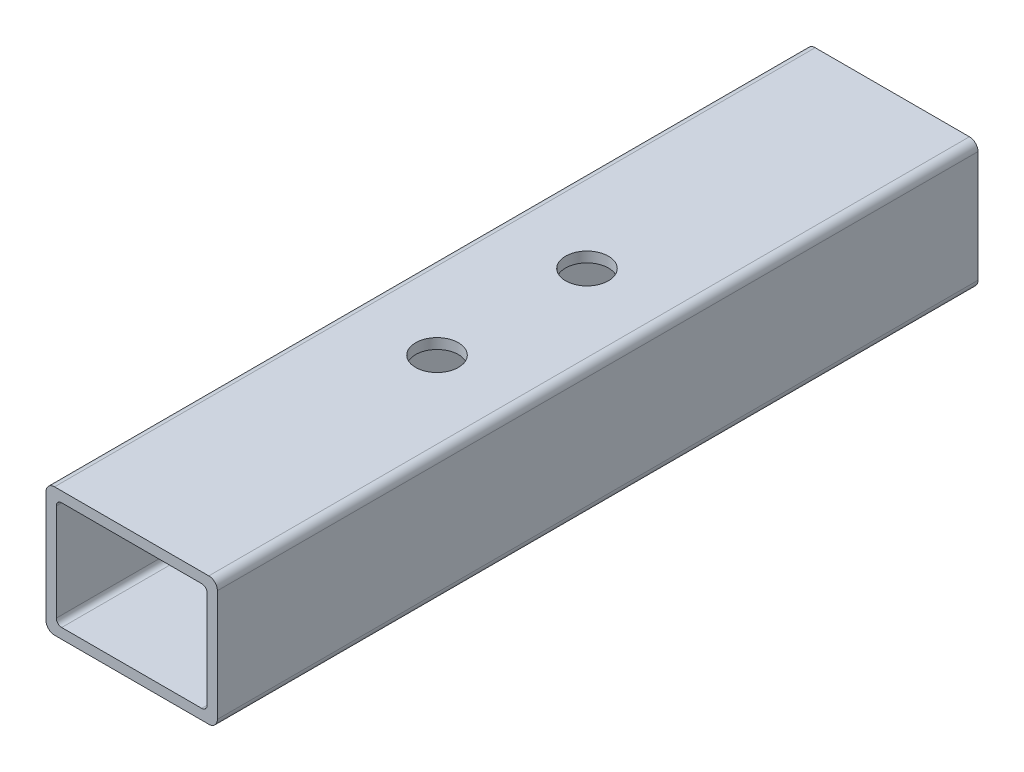
ISO-10303-21;
HEADER;
FILE_DESCRIPTION(('STEP AP214'),'2;1');
FILE_NAME('part.step','',(''),(''),'','','');
FILE_SCHEMA(('AUTOMOTIVE_DESIGN { 1 0 10303 214 1 1 1 1 }'));
ENDSEC;
DATA;
#1=APPLICATION_CONTEXT('core data for automotive mechanical design processes');
#2=APPLICATION_PROTOCOL_DEFINITION('international standard','automotive_design',2000,#1);
#3=PRODUCT_CONTEXT('',#1,'mechanical');
#4=PRODUCT('Part','Part','',(#3));
#5=PRODUCT_RELATED_PRODUCT_CATEGORY('part','',(#4));
#6=PRODUCT_DEFINITION_FORMATION('','',#4);
#7=PRODUCT_DEFINITION_CONTEXT('part definition',#1,'design');
#8=PRODUCT_DEFINITION('design','',#6,#7);
#9=PRODUCT_DEFINITION_SHAPE('','',#8);
#10=(LENGTH_UNIT() NAMED_UNIT(*) SI_UNIT(.MILLI.,.METRE.));
#11=(NAMED_UNIT(*) PLANE_ANGLE_UNIT() SI_UNIT($,.RADIAN.));
#12=(NAMED_UNIT(*) SI_UNIT($,.STERADIAN.) SOLID_ANGLE_UNIT());
#13=UNCERTAINTY_MEASURE_WITH_UNIT(LENGTH_MEASURE(1.E-05),#10,'distance_accuracy_value','');
#14=(GEOMETRIC_REPRESENTATION_CONTEXT(3) GLOBAL_UNCERTAINTY_ASSIGNED_CONTEXT((#13)) GLOBAL_UNIT_ASSIGNED_CONTEXT((#10,
#11,#12)) REPRESENTATION_CONTEXT('',''));
#15=CARTESIAN_POINT('',(0.,0.,0.));
#16=DIRECTION('',(0.,0.,1.));
#17=DIRECTION('',(1.,0.,0.));
#18=AXIS2_PLACEMENT_3D('',#15,#16,#17);
#19=CARTESIAN_POINT('',(22.86,-16.51,225.425));
#20=DIRECTION('',(0.,0.,1.));
#21=DIRECTION('',(1.,0.,0.));
#22=AXIS2_PLACEMENT_3D('',#19,#20,#21);
#23=PLANE('',#22);
#24=CARTESIAN_POINT('',(22.86,-16.51,225.425));
#25=DIRECTION('',(0.,0.,1.));
#26=DIRECTION('',(1.,0.,0.));
#27=AXIS2_PLACEMENT_3D('',#24,#25,#26);
#28=CIRCLE('',#27,2.53999999999999);
#29=CARTESIAN_POINT('',(22.86,-19.05,225.425));
#30=VERTEX_POINT('',#29);
#31=CARTESIAN_POINT('',(25.4,-16.51,225.425));
#32=VERTEX_POINT('',#31);
#33=EDGE_CURVE('E218',#30,#32,#28,.T.);
#34=ORIENTED_EDGE('',*,*,#33,.T.);
#35=DIRECTION('',(0.,1.,0.));
#36=VECTOR('',#35,1.);
#37=CARTESIAN_POINT('',(25.4,-16.51,225.425));
#38=LINE('',#37,#36);
#39=CARTESIAN_POINT('',(25.4,16.51,225.425));
#40=VERTEX_POINT('',#39);
#41=EDGE_CURVE('E221',#32,#40,#38,.T.);
#42=ORIENTED_EDGE('',*,*,#41,.T.);
#43=CARTESIAN_POINT('',(22.86,16.51,225.425));
#44=DIRECTION('',(0.,0.,1.));
#45=DIRECTION('',(1.,0.,0.));
#46=AXIS2_PLACEMENT_3D('',#43,#44,#45);
#47=CIRCLE('',#46,2.54);
#48=CARTESIAN_POINT('',(22.86,19.05,225.425));
#49=VERTEX_POINT('',#48);
#50=EDGE_CURVE('E224',#40,#49,#47,.T.);
#51=ORIENTED_EDGE('',*,*,#50,.T.);
#52=DIRECTION('',(-1.,0.,0.));
#53=VECTOR('',#52,1.);
#54=CARTESIAN_POINT('',(22.86,19.05,225.425));
#55=LINE('',#54,#53);
#56=CARTESIAN_POINT('',(-22.86,19.05,225.425));
#57=VERTEX_POINT('',#56);
#58=EDGE_CURVE('E226',#49,#57,#55,.T.);
#59=ORIENTED_EDGE('',*,*,#58,.T.);
#60=CARTESIAN_POINT('',(-22.86,16.51,225.425));
#61=DIRECTION('',(0.,0.,1.));
#62=DIRECTION('',(1.,0.,0.));
#63=AXIS2_PLACEMENT_3D('',#60,#61,#62);
#64=CIRCLE('',#63,2.54);
#65=CARTESIAN_POINT('',(-25.4,16.51,225.425));
#66=VERTEX_POINT('',#65);
#67=EDGE_CURVE('E228',#57,#66,#64,.T.);
#68=ORIENTED_EDGE('',*,*,#67,.T.);
#69=DIRECTION('',(0.,-1.,0.));
#70=VECTOR('',#69,1.);
#71=CARTESIAN_POINT('',(-25.4,-16.51,225.425));
#72=LINE('',#71,#70);
#73=CARTESIAN_POINT('',(-25.4,-16.51,225.425));
#74=VERTEX_POINT('',#73);
#75=EDGE_CURVE('E230',#66,#74,#72,.T.);
#76=ORIENTED_EDGE('',*,*,#75,.T.);
#77=CARTESIAN_POINT('',(-22.86,-16.51,225.425));
#78=DIRECTION('',(0.,0.,1.));
#79=DIRECTION('',(1.,0.,0.));
#80=AXIS2_PLACEMENT_3D('',#77,#78,#79);
#81=CIRCLE('',#80,2.54);
#82=CARTESIAN_POINT('',(-22.86,-19.05,225.425));
#83=VERTEX_POINT('',#82);
#84=EDGE_CURVE('E232',#74,#83,#81,.T.);
#85=ORIENTED_EDGE('',*,*,#84,.T.);
#86=DIRECTION('',(1.,0.,0.));
#87=VECTOR('',#86,1.);
#88=CARTESIAN_POINT('',(22.86,-19.05,225.425));
#89=LINE('',#88,#87);
#90=EDGE_CURVE('E234',#83,#30,#89,.T.);
#91=ORIENTED_EDGE('',*,*,#90,.T.);
#92=EDGE_LOOP('',(#34,#42,#51,#59,#68,#76,#85,#91));
#93=FACE_BOUND('',#92,.T.);
#94=DIRECTION('',(-1.,0.,0.));
#95=VECTOR('',#94,1.);
#96=CARTESIAN_POINT('',(20.7518,16.002,225.425));
#97=LINE('',#96,#95);
#98=CARTESIAN_POINT('',(20.7518,16.002,225.425));
#99=VERTEX_POINT('',#98);
#100=CARTESIAN_POINT('',(-20.7518,16.002,225.425));
#101=VERTEX_POINT('',#100);
#102=EDGE_CURVE('E159',#99,#101,#97,.T.);
#103=ORIENTED_EDGE('',*,*,#102,.F.);
#104=CARTESIAN_POINT('',(20.7518,14.4018,225.425));
#105=DIRECTION('',(0.,0.,1.));
#106=DIRECTION('',(1.,0.,0.));
#107=AXIS2_PLACEMENT_3D('',#104,#105,#106);
#108=CIRCLE('',#107,1.6002);
#109=CARTESIAN_POINT('',(22.352,14.4018,225.425));
#110=VERTEX_POINT('',#109);
#111=EDGE_CURVE('E151',#110,#99,#108,.T.);
#112=ORIENTED_EDGE('',*,*,#111,.F.);
#113=DIRECTION('',(0.,1.,0.));
#114=VECTOR('',#113,1.);
#115=CARTESIAN_POINT('',(22.352,14.4018,225.425));
#116=LINE('',#115,#114);
#117=CARTESIAN_POINT('',(22.352,-14.4018,225.425));
#118=VERTEX_POINT('',#117);
#119=EDGE_CURVE('E185',#118,#110,#116,.T.);
#120=ORIENTED_EDGE('',*,*,#119,.F.);
#121=CARTESIAN_POINT('',(20.7518,-14.4018,225.425));
#122=DIRECTION('',(0.,0.,1.));
#123=DIRECTION('',(1.,0.,0.));
#124=AXIS2_PLACEMENT_3D('',#121,#122,#123);
#125=CIRCLE('',#124,1.6002);
#126=CARTESIAN_POINT('',(20.7518,-16.002,225.425));
#127=VERTEX_POINT('',#126);
#128=EDGE_CURVE('E183',#127,#118,#125,.T.);
#129=ORIENTED_EDGE('',*,*,#128,.F.);
#130=DIRECTION('',(1.,0.,0.));
#131=VECTOR('',#130,1.);
#132=CARTESIAN_POINT('',(20.7518,-16.002,225.425));
#133=LINE('',#132,#131);
#134=CARTESIAN_POINT('',(-20.7518,-16.002,225.425));
#135=VERTEX_POINT('',#134);
#136=EDGE_CURVE('E181',#135,#127,#133,.T.);
#137=ORIENTED_EDGE('',*,*,#136,.F.);
#138=CARTESIAN_POINT('',(-20.7518,-14.4018,225.425));
#139=DIRECTION('',(0.,0.,1.));
#140=DIRECTION('',(1.,0.,0.));
#141=AXIS2_PLACEMENT_3D('',#138,#139,#140);
#142=CIRCLE('',#141,1.6002);
#143=CARTESIAN_POINT('',(-22.352,-14.4018,225.425));
#144=VERTEX_POINT('',#143);
#145=EDGE_CURVE('E179',#144,#135,#142,.T.);
#146=ORIENTED_EDGE('',*,*,#145,.F.);
#147=DIRECTION('',(0.,-1.,0.));
#148=VECTOR('',#147,1.);
#149=CARTESIAN_POINT('',(-22.352,14.4018,225.425));
#150=LINE('',#149,#148);
#151=CARTESIAN_POINT('',(-22.352,14.4018,225.425));
#152=VERTEX_POINT('',#151);
#153=EDGE_CURVE('E174',#152,#144,#150,.T.);
#154=ORIENTED_EDGE('',*,*,#153,.F.);
#155=CARTESIAN_POINT('',(-20.7518,14.4018,225.425));
#156=DIRECTION('',(0.,0.,1.));
#157=DIRECTION('',(1.,0.,0.));
#158=AXIS2_PLACEMENT_3D('',#155,#156,#157);
#159=CIRCLE('',#158,1.6002);
#160=EDGE_CURVE('E172',#101,#152,#159,.T.);
#161=ORIENTED_EDGE('',*,*,#160,.F.);
#162=EDGE_LOOP('',(#103,#112,#120,#129,#137,#146,#154,#161));
#163=FACE_BOUND('',#162,.T.);
#164=ADVANCED_FACE('F38',(#93,#163),#23,.T.);
#165=CARTESIAN_POINT('',(22.86,-16.51,0.));
#166=DIRECTION('',(0.,0.,1.));
#167=DIRECTION('',(1.,0.,0.));
#168=AXIS2_PLACEMENT_3D('',#165,#166,#167);
#169=PLANE('',#168);
#170=CARTESIAN_POINT('',(22.86,-16.51,0.));
#171=DIRECTION('',(0.,0.,1.));
#172=DIRECTION('',(1.,0.,0.));
#173=AXIS2_PLACEMENT_3D('',#170,#171,#172);
#174=CIRCLE('',#173,2.53999999999999);
#175=CARTESIAN_POINT('',(22.86,-19.05,0.));
#176=VERTEX_POINT('',#175);
#177=CARTESIAN_POINT('',(25.4,-16.51,0.));
#178=VERTEX_POINT('',#177);
#179=EDGE_CURVE('E167',#176,#178,#174,.T.);
#180=ORIENTED_EDGE('',*,*,#179,.F.);
#181=DIRECTION('',(1.,0.,0.));
#182=VECTOR('',#181,1.);
#183=CARTESIAN_POINT('',(22.86,-19.05,0.));
#184=LINE('',#183,#182);
#185=CARTESIAN_POINT('',(-22.86,-19.05,0.));
#186=VERTEX_POINT('',#185);
#187=EDGE_CURVE('E222',#186,#176,#184,.T.);
#188=ORIENTED_EDGE('',*,*,#187,.F.);
#189=CARTESIAN_POINT('',(-22.86,-16.51,0.));
#190=DIRECTION('',(0.,0.,1.));
#191=DIRECTION('',(1.,0.,0.));
#192=AXIS2_PLACEMENT_3D('',#189,#190,#191);
#193=CIRCLE('',#192,2.54);
#194=CARTESIAN_POINT('',(-25.4,-16.51,0.));
#195=VERTEX_POINT('',#194);
#196=EDGE_CURVE('E249',#195,#186,#193,.T.);
#197=ORIENTED_EDGE('',*,*,#196,.F.);
#198=DIRECTION('',(0.,-1.,0.));
#199=VECTOR('',#198,1.);
#200=CARTESIAN_POINT('',(-25.4,-16.51,0.));
#201=LINE('',#200,#199);
#202=CARTESIAN_POINT('',(-25.4,16.51,0.));
#203=VERTEX_POINT('',#202);
#204=EDGE_CURVE('E247',#203,#195,#201,.T.);
#205=ORIENTED_EDGE('',*,*,#204,.F.);
#206=CARTESIAN_POINT('',(-22.86,16.51,0.));
#207=DIRECTION('',(0.,0.,1.));
#208=DIRECTION('',(1.,0.,0.));
#209=AXIS2_PLACEMENT_3D('',#206,#207,#208);
#210=CIRCLE('',#209,2.54);
#211=CARTESIAN_POINT('',(-22.86,19.05,0.));
#212=VERTEX_POINT('',#211);
#213=EDGE_CURVE('E245',#212,#203,#210,.T.);
#214=ORIENTED_EDGE('',*,*,#213,.F.);
#215=DIRECTION('',(-1.,0.,0.));
#216=VECTOR('',#215,1.);
#217=CARTESIAN_POINT('',(22.86,19.05,0.));
#218=LINE('',#217,#216);
#219=CARTESIAN_POINT('',(22.86,19.05,0.));
#220=VERTEX_POINT('',#219);
#221=EDGE_CURVE('E243',#220,#212,#218,.T.);
#222=ORIENTED_EDGE('',*,*,#221,.F.);
#223=CARTESIAN_POINT('',(22.86,16.51,0.));
#224=DIRECTION('',(0.,0.,1.));
#225=DIRECTION('',(1.,0.,0.));
#226=AXIS2_PLACEMENT_3D('',#223,#224,#225);
#227=CIRCLE('',#226,2.54);
#228=CARTESIAN_POINT('',(25.4,16.51,0.));
#229=VERTEX_POINT('',#228);
#230=EDGE_CURVE('E241',#229,#220,#227,.T.);
#231=ORIENTED_EDGE('',*,*,#230,.F.);
#232=DIRECTION('',(0.,1.,0.));
#233=VECTOR('',#232,1.);
#234=CARTESIAN_POINT('',(25.4,-16.51,0.));
#235=LINE('',#234,#233);
#236=EDGE_CURVE('E239',#178,#229,#235,.T.);
#237=ORIENTED_EDGE('',*,*,#236,.F.);
#238=EDGE_LOOP('',(#180,#188,#197,#205,#214,#222,#231,#237));
#239=FACE_BOUND('',#238,.T.);
#240=CARTESIAN_POINT('',(20.7518,14.4018,0.));
#241=DIRECTION('',(0.,0.,1.));
#242=DIRECTION('',(1.,0.,0.));
#243=AXIS2_PLACEMENT_3D('',#240,#241,#242);
#244=CIRCLE('',#243,1.6002);
#245=CARTESIAN_POINT('',(22.352,14.4018,0.));
#246=VERTEX_POINT('',#245);
#247=CARTESIAN_POINT('',(20.7518,16.002,0.));
#248=VERTEX_POINT('',#247);
#249=EDGE_CURVE('E61',#246,#248,#244,.T.);
#250=ORIENTED_EDGE('',*,*,#249,.T.);
#251=DIRECTION('',(-1.,0.,0.));
#252=VECTOR('',#251,1.);
#253=CARTESIAN_POINT('',(20.7518,16.002,0.));
#254=LINE('',#253,#252);
#255=CARTESIAN_POINT('',(-20.7518,16.002,0.));
#256=VERTEX_POINT('',#255);
#257=EDGE_CURVE('E166',#248,#256,#254,.T.);
#258=ORIENTED_EDGE('',*,*,#257,.T.);
#259=CARTESIAN_POINT('',(-20.7518,14.4018,0.));
#260=DIRECTION('',(0.,0.,1.));
#261=DIRECTION('',(1.,0.,0.));
#262=AXIS2_PLACEMENT_3D('',#259,#260,#261);
#263=CIRCLE('',#262,1.6002);
#264=CARTESIAN_POINT('',(-22.352,14.4018,0.));
#265=VERTEX_POINT('',#264);
#266=EDGE_CURVE('E190',#256,#265,#263,.T.);
#267=ORIENTED_EDGE('',*,*,#266,.T.);
#268=DIRECTION('',(0.,-1.,0.));
#269=VECTOR('',#268,1.);
#270=CARTESIAN_POINT('',(-22.352,14.4018,0.));
#271=LINE('',#270,#269);
#272=CARTESIAN_POINT('',(-22.352,-14.4018,0.));
#273=VERTEX_POINT('',#272);
#274=EDGE_CURVE('E193',#265,#273,#271,.T.);
#275=ORIENTED_EDGE('',*,*,#274,.T.);
#276=CARTESIAN_POINT('',(-20.7518,-14.4018,0.));
#277=DIRECTION('',(0.,0.,1.));
#278=DIRECTION('',(1.,0.,0.));
#279=AXIS2_PLACEMENT_3D('',#276,#277,#278);
#280=CIRCLE('',#279,1.6002);
#281=CARTESIAN_POINT('',(-20.7518,-16.002,0.));
#282=VERTEX_POINT('',#281);
#283=EDGE_CURVE('E196',#273,#282,#280,.T.);
#284=ORIENTED_EDGE('',*,*,#283,.T.);
#285=DIRECTION('',(1.,0.,0.));
#286=VECTOR('',#285,1.);
#287=CARTESIAN_POINT('',(20.7518,-16.002,0.));
#288=LINE('',#287,#286);
#289=CARTESIAN_POINT('',(20.7518,-16.002,0.));
#290=VERTEX_POINT('',#289);
#291=EDGE_CURVE('E199',#282,#290,#288,.T.);
#292=ORIENTED_EDGE('',*,*,#291,.T.);
#293=CARTESIAN_POINT('',(20.7518,-14.4018,0.));
#294=DIRECTION('',(0.,0.,1.));
#295=DIRECTION('',(1.,0.,0.));
#296=AXIS2_PLACEMENT_3D('',#293,#294,#295);
#297=CIRCLE('',#296,1.6002);
#298=CARTESIAN_POINT('',(22.352,-14.4018,0.));
#299=VERTEX_POINT('',#298);
#300=EDGE_CURVE('E202',#290,#299,#297,.T.);
#301=ORIENTED_EDGE('',*,*,#300,.T.);
#302=DIRECTION('',(0.,1.,0.));
#303=VECTOR('',#302,1.);
#304=CARTESIAN_POINT('',(22.352,14.4018,0.));
#305=LINE('',#304,#303);
#306=EDGE_CURVE('E160',#299,#246,#305,.T.);
#307=ORIENTED_EDGE('',*,*,#306,.T.);
#308=EDGE_LOOP('',(#250,#258,#267,#275,#284,#292,#301,#307));
#309=FACE_BOUND('',#308,.T.);
#310=ADVANCED_FACE('F279',(#239,#309),#169,.F.);
#311=CARTESIAN_POINT('',(22.86,-16.51,225.425));
#312=DIRECTION('',(0.,0.,-1.));
#313=DIRECTION('',(-1.,0.,0.));
#314=AXIS2_PLACEMENT_3D('',#311,#312,#313);
#315=CYLINDRICAL_SURFACE('',#314,2.53999999999999);
#316=ORIENTED_EDGE('',*,*,#179,.T.);
#317=DIRECTION('',(0.,0.,-1.));
#318=VECTOR('',#317,1.);
#319=CARTESIAN_POINT('',(25.4,-16.51,225.425));
#320=LINE('',#319,#318);
#321=EDGE_CURVE('E11',#32,#178,#320,.T.);
#322=ORIENTED_EDGE('',*,*,#321,.F.);
#323=ORIENTED_EDGE('',*,*,#33,.F.);
#324=DIRECTION('',(0.,0.,-1.));
#325=VECTOR('',#324,1.);
#326=CARTESIAN_POINT('',(22.86,-19.05,225.425));
#327=LINE('',#326,#325);
#328=EDGE_CURVE('E236',#30,#176,#327,.T.);
#329=ORIENTED_EDGE('',*,*,#328,.T.);
#330=EDGE_LOOP('',(#316,#322,#323,#329));
#331=FACE_BOUND('',#330,.T.);
#332=ADVANCED_FACE('F40',(#331),#315,.T.);
#333=CARTESIAN_POINT('',(25.4,-16.51,225.425));
#334=DIRECTION('',(-1.,0.,0.));
#335=DIRECTION('',(0.,0.,1.));
#336=AXIS2_PLACEMENT_3D('',#333,#334,#335);
#337=PLANE('',#336);
#338=ORIENTED_EDGE('',*,*,#236,.T.);
#339=DIRECTION('',(0.,0.,-1.));
#340=VECTOR('',#339,1.);
#341=CARTESIAN_POINT('',(25.4,16.51,225.425));
#342=LINE('',#341,#340);
#343=EDGE_CURVE('E46',#40,#229,#342,.T.);
#344=ORIENTED_EDGE('',*,*,#343,.F.);
#345=ORIENTED_EDGE('',*,*,#41,.F.);
#346=ORIENTED_EDGE('',*,*,#321,.T.);
#347=EDGE_LOOP('',(#338,#344,#345,#346));
#348=FACE_BOUND('',#347,.T.);
#349=ADVANCED_FACE('F296',(#348),#337,.F.);
#350=CARTESIAN_POINT('',(22.86,16.51,225.425));
#351=DIRECTION('',(0.,0.,-1.));
#352=DIRECTION('',(-1.,0.,0.));
#353=AXIS2_PLACEMENT_3D('',#350,#351,#352);
#354=CYLINDRICAL_SURFACE('',#353,2.54);
#355=ORIENTED_EDGE('',*,*,#230,.T.);
#356=DIRECTION('',(0.,0.,-1.));
#357=VECTOR('',#356,1.);
#358=CARTESIAN_POINT('',(22.86,19.05,225.425));
#359=LINE('',#358,#357);
#360=EDGE_CURVE('E266',#49,#220,#359,.T.);
#361=ORIENTED_EDGE('',*,*,#360,.F.);
#362=ORIENTED_EDGE('',*,*,#50,.F.);
#363=ORIENTED_EDGE('',*,*,#343,.T.);
#364=EDGE_LOOP('',(#355,#361,#362,#363));
#365=FACE_BOUND('',#364,.T.);
#366=ADVANCED_FACE('F273',(#365),#354,.T.);
#367=CARTESIAN_POINT('',(22.86,19.05,225.425));
#368=DIRECTION('',(0.,-1.,0.));
#369=DIRECTION('',(0.,0.,-1.));
#370=AXIS2_PLACEMENT_3D('',#367,#368,#369);
#371=PLANE('',#370);
#372=CARTESIAN_POINT('',(0.,19.05,134.9375));
#373=DIRECTION('',(0.,1.,0.));
#374=DIRECTION('',(0.,0.,1.));
#375=AXIS2_PLACEMENT_3D('',#372,#373,#374);
#376=CIRCLE('',#375,6.35);
#377=CARTESIAN_POINT('',(0.,19.05,141.2875));
#378=VERTEX_POINT('',#377);
#379=EDGE_CURVE('E188',#378,#378,#376,.T.);
#380=ORIENTED_EDGE('',*,*,#379,.F.);
#381=EDGE_LOOP('',(#380));
#382=FACE_BOUND('',#381,.T.);
#383=CARTESIAN_POINT('',(0.,19.05,90.4875));
#384=DIRECTION('',(0.,1.,0.));
#385=DIRECTION('',(0.,0.,1.));
#386=AXIS2_PLACEMENT_3D('',#383,#384,#385);
#387=CIRCLE('',#386,6.35);
#388=CARTESIAN_POINT('',(0.,19.05,96.8375));
#389=VERTEX_POINT('',#388);
#390=EDGE_CURVE('E379',#389,#389,#387,.T.);
#391=ORIENTED_EDGE('',*,*,#390,.F.);
#392=EDGE_LOOP('',(#391));
#393=FACE_BOUND('',#392,.T.);
#394=ORIENTED_EDGE('',*,*,#221,.T.);
#395=DIRECTION('',(0.,0.,-1.));
#396=VECTOR('',#395,1.);
#397=CARTESIAN_POINT('',(-22.86,19.05,225.425));
#398=LINE('',#397,#396);
#399=EDGE_CURVE('E263',#57,#212,#398,.T.);
#400=ORIENTED_EDGE('',*,*,#399,.F.);
#401=ORIENTED_EDGE('',*,*,#58,.F.);
#402=ORIENTED_EDGE('',*,*,#360,.T.);
#403=EDGE_LOOP('',(#394,#400,#401,#402));
#404=FACE_BOUND('',#403,.T.);
#405=ADVANCED_FACE('F285',(#382,#393,#404),#371,.F.);
#406=CARTESIAN_POINT('',(-22.86,16.51,225.425));
#407=DIRECTION('',(0.,0.,-1.));
#408=DIRECTION('',(-1.,0.,0.));
#409=AXIS2_PLACEMENT_3D('',#406,#407,#408);
#410=CYLINDRICAL_SURFACE('',#409,2.54);
#411=ORIENTED_EDGE('',*,*,#213,.T.);
#412=DIRECTION('',(0.,0.,-1.));
#413=VECTOR('',#412,1.);
#414=CARTESIAN_POINT('',(-25.4,16.51,225.425));
#415=LINE('',#414,#413);
#416=EDGE_CURVE('E260',#66,#203,#415,.T.);
#417=ORIENTED_EDGE('',*,*,#416,.F.);
#418=ORIENTED_EDGE('',*,*,#67,.F.);
#419=ORIENTED_EDGE('',*,*,#399,.T.);
#420=EDGE_LOOP('',(#411,#417,#418,#419));
#421=FACE_BOUND('',#420,.T.);
#422=ADVANCED_FACE('F289',(#421),#410,.T.);
#423=CARTESIAN_POINT('',(-25.4,-16.51,225.425));
#424=DIRECTION('',(1.,0.,0.));
#425=DIRECTION('',(0.,1.,0.));
#426=AXIS2_PLACEMENT_3D('',#423,#424,#425);
#427=PLANE('',#426);
#428=ORIENTED_EDGE('',*,*,#204,.T.);
#429=DIRECTION('',(0.,0.,-1.));
#430=VECTOR('',#429,1.);
#431=CARTESIAN_POINT('',(-25.4,-16.51,225.425));
#432=LINE('',#431,#430);
#433=EDGE_CURVE('E257',#74,#195,#432,.T.);
#434=ORIENTED_EDGE('',*,*,#433,.F.);
#435=ORIENTED_EDGE('',*,*,#75,.F.);
#436=ORIENTED_EDGE('',*,*,#416,.T.);
#437=EDGE_LOOP('',(#428,#434,#435,#436));
#438=FACE_BOUND('',#437,.T.);
#439=ADVANCED_FACE('F309',(#438),#427,.F.);
#440=CARTESIAN_POINT('',(-22.86,-16.51,225.425));
#441=DIRECTION('',(0.,0.,-1.));
#442=DIRECTION('',(-1.,0.,0.));
#443=AXIS2_PLACEMENT_3D('',#440,#441,#442);
#444=CYLINDRICAL_SURFACE('',#443,2.54);
#445=ORIENTED_EDGE('',*,*,#196,.T.);
#446=DIRECTION('',(0.,0.,-1.));
#447=VECTOR('',#446,1.);
#448=CARTESIAN_POINT('',(-22.86,-19.05,225.425));
#449=LINE('',#448,#447);
#450=EDGE_CURVE('E254',#83,#186,#449,.T.);
#451=ORIENTED_EDGE('',*,*,#450,.F.);
#452=ORIENTED_EDGE('',*,*,#84,.F.);
#453=ORIENTED_EDGE('',*,*,#433,.T.);
#454=EDGE_LOOP('',(#445,#451,#452,#453));
#455=FACE_BOUND('',#454,.T.);
#456=ADVANCED_FACE('F307',(#455),#444,.T.);
#457=CARTESIAN_POINT('',(22.86,-19.05,225.425));
#458=DIRECTION('',(0.,1.,0.));
#459=DIRECTION('',(-1.,0.,0.));
#460=AXIS2_PLACEMENT_3D('',#457,#458,#459);
#461=PLANE('',#460);
#462=ORIENTED_EDGE('',*,*,#187,.T.);
#463=ORIENTED_EDGE('',*,*,#328,.F.);
#464=ORIENTED_EDGE('',*,*,#90,.F.);
#465=ORIENTED_EDGE('',*,*,#450,.T.);
#466=EDGE_LOOP('',(#462,#463,#464,#465));
#467=FACE_BOUND('',#466,.T.);
#468=ADVANCED_FACE('F302',(#467),#461,.F.);
#469=CARTESIAN_POINT('',(20.7518,14.4018,225.425));
#470=DIRECTION('',(0.,0.,-1.));
#471=DIRECTION('',(-1.,0.,0.));
#472=AXIS2_PLACEMENT_3D('',#469,#470,#471);
#473=CYLINDRICAL_SURFACE('',#472,1.6002);
#474=ORIENTED_EDGE('',*,*,#249,.F.);
#475=DIRECTION('',(0.,0.,-1.));
#476=VECTOR('',#475,1.);
#477=CARTESIAN_POINT('',(22.352,14.4018,225.425));
#478=LINE('',#477,#476);
#479=EDGE_CURVE('E155',#110,#246,#478,.T.);
#480=ORIENTED_EDGE('',*,*,#479,.F.);
#481=ORIENTED_EDGE('',*,*,#111,.T.);
#482=DIRECTION('',(0.,0.,-1.));
#483=VECTOR('',#482,1.);
#484=CARTESIAN_POINT('',(20.7518,16.002,225.425));
#485=LINE('',#484,#483);
#486=EDGE_CURVE('E154',#99,#248,#485,.T.);
#487=ORIENTED_EDGE('',*,*,#486,.T.);
#488=EDGE_LOOP('',(#474,#480,#481,#487));
#489=FACE_BOUND('',#488,.T.);
#490=ADVANCED_FACE('F153',(#489),#473,.F.);
#491=CARTESIAN_POINT('',(20.7518,16.002,225.425));
#492=DIRECTION('',(0.,-1.,0.));
#493=DIRECTION('',(1.,0.,0.));
#494=AXIS2_PLACEMENT_3D('',#491,#492,#493);
#495=PLANE('',#494);
#496=CARTESIAN_POINT('',(0.,16.002,134.9375));
#497=DIRECTION('',(0.,-1.,0.));
#498=DIRECTION('',(1.,0.,0.));
#499=AXIS2_PLACEMENT_3D('',#496,#497,#498);
#500=CIRCLE('',#499,6.35);
#501=CARTESIAN_POINT('',(6.35,16.002,134.9375));
#502=VERTEX_POINT('',#501);
#503=EDGE_CURVE('E374',#502,#502,#500,.F.);
#504=ORIENTED_EDGE('',*,*,#503,.T.);
#505=EDGE_LOOP('',(#504));
#506=FACE_BOUND('',#505,.T.);
#507=CARTESIAN_POINT('',(0.,16.002,90.4875));
#508=DIRECTION('',(0.,-1.,0.));
#509=DIRECTION('',(1.,0.,0.));
#510=AXIS2_PLACEMENT_3D('',#507,#508,#509);
#511=CIRCLE('',#510,6.35);
#512=CARTESIAN_POINT('',(6.35,16.002,90.4875));
#513=VERTEX_POINT('',#512);
#514=EDGE_CURVE('E382',#513,#513,#511,.F.);
#515=ORIENTED_EDGE('',*,*,#514,.T.);
#516=EDGE_LOOP('',(#515));
#517=FACE_BOUND('',#516,.T.);
#518=ORIENTED_EDGE('',*,*,#257,.F.);
#519=ORIENTED_EDGE('',*,*,#486,.F.);
#520=ORIENTED_EDGE('',*,*,#102,.T.);
#521=DIRECTION('',(0.,0.,-1.));
#522=VECTOR('',#521,1.);
#523=CARTESIAN_POINT('',(-20.7518,16.002,225.425));
#524=LINE('',#523,#522);
#525=EDGE_CURVE('E168',#101,#256,#524,.T.);
#526=ORIENTED_EDGE('',*,*,#525,.T.);
#527=EDGE_LOOP('',(#518,#519,#520,#526));
#528=FACE_BOUND('',#527,.T.);
#529=ADVANCED_FACE('F163',(#506,#517,#528),#495,.T.);
#530=CARTESIAN_POINT('',(-20.7518,14.4018,225.425));
#531=DIRECTION('',(0.,0.,-1.));
#532=DIRECTION('',(-1.,0.,0.));
#533=AXIS2_PLACEMENT_3D('',#530,#531,#532);
#534=CYLINDRICAL_SURFACE('',#533,1.6002);
#535=ORIENTED_EDGE('',*,*,#266,.F.);
#536=ORIENTED_EDGE('',*,*,#525,.F.);
#537=ORIENTED_EDGE('',*,*,#160,.T.);
#538=DIRECTION('',(0.,0.,-1.));
#539=VECTOR('',#538,1.);
#540=CARTESIAN_POINT('',(-22.352,14.4018,225.425));
#541=LINE('',#540,#539);
#542=EDGE_CURVE('E215',#152,#265,#541,.T.);
#543=ORIENTED_EDGE('',*,*,#542,.T.);
#544=EDGE_LOOP('',(#535,#536,#537,#543));
#545=FACE_BOUND('',#544,.T.);
#546=ADVANCED_FACE('F334',(#545),#534,.F.);
#547=CARTESIAN_POINT('',(-22.352,14.4018,225.425));
#548=DIRECTION('',(1.,0.,0.));
#549=DIRECTION('',(0.,1.,0.));
#550=AXIS2_PLACEMENT_3D('',#547,#548,#549);
#551=PLANE('',#550);
#552=ORIENTED_EDGE('',*,*,#274,.F.);
#553=ORIENTED_EDGE('',*,*,#542,.F.);
#554=ORIENTED_EDGE('',*,*,#153,.T.);
#555=DIRECTION('',(0.,0.,-1.));
#556=VECTOR('',#555,1.);
#557=CARTESIAN_POINT('',(-22.352,-14.4018,225.425));
#558=LINE('',#557,#556);
#559=EDGE_CURVE('E213',#144,#273,#558,.T.);
#560=ORIENTED_EDGE('',*,*,#559,.T.);
#561=EDGE_LOOP('',(#552,#553,#554,#560));
#562=FACE_BOUND('',#561,.T.);
#563=ADVANCED_FACE('F339',(#562),#551,.T.);
#564=CARTESIAN_POINT('',(-20.7518,-14.4018,225.425));
#565=DIRECTION('',(0.,0.,-1.));
#566=DIRECTION('',(-1.,0.,0.));
#567=AXIS2_PLACEMENT_3D('',#564,#565,#566);
#568=CYLINDRICAL_SURFACE('',#567,1.6002);
#569=ORIENTED_EDGE('',*,*,#283,.F.);
#570=ORIENTED_EDGE('',*,*,#559,.F.);
#571=ORIENTED_EDGE('',*,*,#145,.T.);
#572=DIRECTION('',(0.,0.,-1.));
#573=VECTOR('',#572,1.);
#574=CARTESIAN_POINT('',(-20.7518,-16.002,225.425));
#575=LINE('',#574,#573);
#576=EDGE_CURVE('E211',#135,#282,#575,.T.);
#577=ORIENTED_EDGE('',*,*,#576,.T.);
#578=EDGE_LOOP('',(#569,#570,#571,#577));
#579=FACE_BOUND('',#578,.T.);
#580=ADVANCED_FACE('F347',(#579),#568,.F.);
#581=CARTESIAN_POINT('',(20.7518,-16.002,225.425));
#582=DIRECTION('',(0.,1.,0.));
#583=DIRECTION('',(-1.,0.,0.));
#584=AXIS2_PLACEMENT_3D('',#581,#582,#583);
#585=PLANE('',#584);
#586=ORIENTED_EDGE('',*,*,#291,.F.);
#587=ORIENTED_EDGE('',*,*,#576,.F.);
#588=ORIENTED_EDGE('',*,*,#136,.T.);
#589=DIRECTION('',(0.,0.,-1.));
#590=VECTOR('',#589,1.);
#591=CARTESIAN_POINT('',(20.7518,-16.002,225.425));
#592=LINE('',#591,#590);
#593=EDGE_CURVE('E209',#127,#290,#592,.T.);
#594=ORIENTED_EDGE('',*,*,#593,.T.);
#595=EDGE_LOOP('',(#586,#587,#588,#594));
#596=FACE_BOUND('',#595,.T.);
#597=ADVANCED_FACE('F351',(#596),#585,.T.);
#598=CARTESIAN_POINT('',(20.7518,-14.4018,225.425));
#599=DIRECTION('',(0.,0.,-1.));
#600=DIRECTION('',(-1.,0.,0.));
#601=AXIS2_PLACEMENT_3D('',#598,#599,#600);
#602=CYLINDRICAL_SURFACE('',#601,1.6002);
#603=ORIENTED_EDGE('',*,*,#300,.F.);
#604=ORIENTED_EDGE('',*,*,#593,.F.);
#605=ORIENTED_EDGE('',*,*,#128,.T.);
#606=DIRECTION('',(0.,0.,-1.));
#607=VECTOR('',#606,1.);
#608=CARTESIAN_POINT('',(22.352,-14.4018,225.425));
#609=LINE('',#608,#607);
#610=EDGE_CURVE('E53',#118,#299,#609,.T.);
#611=ORIENTED_EDGE('',*,*,#610,.T.);
#612=EDGE_LOOP('',(#603,#604,#605,#611));
#613=FACE_BOUND('',#612,.T.);
#614=ADVANCED_FACE('F355',(#613),#602,.F.);
#615=CARTESIAN_POINT('',(22.352,14.4018,225.425));
#616=DIRECTION('',(-1.,0.,0.));
#617=DIRECTION('',(0.,-1.,0.));
#618=AXIS2_PLACEMENT_3D('',#615,#616,#617);
#619=PLANE('',#618);
#620=ORIENTED_EDGE('',*,*,#306,.F.);
#621=ORIENTED_EDGE('',*,*,#610,.F.);
#622=ORIENTED_EDGE('',*,*,#119,.T.);
#623=ORIENTED_EDGE('',*,*,#479,.T.);
#624=EDGE_LOOP('',(#620,#621,#622,#623));
#625=FACE_BOUND('',#624,.T.);
#626=ADVANCED_FACE('F359',(#625),#619,.T.);
#627=CARTESIAN_POINT('',(0.,-19.051,90.4875));
#628=DIRECTION('',(0.,1.,0.));
#629=DIRECTION('',(-1.,0.,0.));
#630=AXIS2_PLACEMENT_3D('',#627,#628,#629);
#631=CYLINDRICAL_SURFACE('',#630,6.35);
#632=ORIENTED_EDGE('',*,*,#514,.F.);
#633=EDGE_LOOP('',(#632));
#634=FACE_BOUND('',#633,.T.);
#635=ORIENTED_EDGE('',*,*,#390,.T.);
#636=EDGE_LOOP('',(#635));
#637=FACE_BOUND('',#636,.T.);
#638=ADVANCED_FACE('F363',(#634,#637),#631,.F.);
#639=CARTESIAN_POINT('',(0.,-19.051,134.9375));
#640=DIRECTION('',(0.,1.,0.));
#641=DIRECTION('',(-1.,0.,0.));
#642=AXIS2_PLACEMENT_3D('',#639,#640,#641);
#643=CYLINDRICAL_SURFACE('',#642,6.35);
#644=ORIENTED_EDGE('',*,*,#503,.F.);
#645=EDGE_LOOP('',(#644));
#646=FACE_BOUND('',#645,.T.);
#647=ORIENTED_EDGE('',*,*,#379,.T.);
#648=EDGE_LOOP('',(#647));
#649=FACE_BOUND('',#648,.T.);
#650=ADVANCED_FACE('F366',(#646,#649),#643,.F.);
#651=CLOSED_SHELL('',(#164,#310,#332,#349,#366,#405,#422,#439,#456,#468,#490,#529,#546,#563,
#580,#597,#614,#626,#638,#650));
#652=MANIFOLD_SOLID_BREP('B2',#651);
#653=ADVANCED_BREP_SHAPE_REPRESENTATION('',(#18,#652),#14);
#654=SHAPE_DEFINITION_REPRESENTATION(#9,#653);
ENDSEC;
END-ISO-10303-21;
